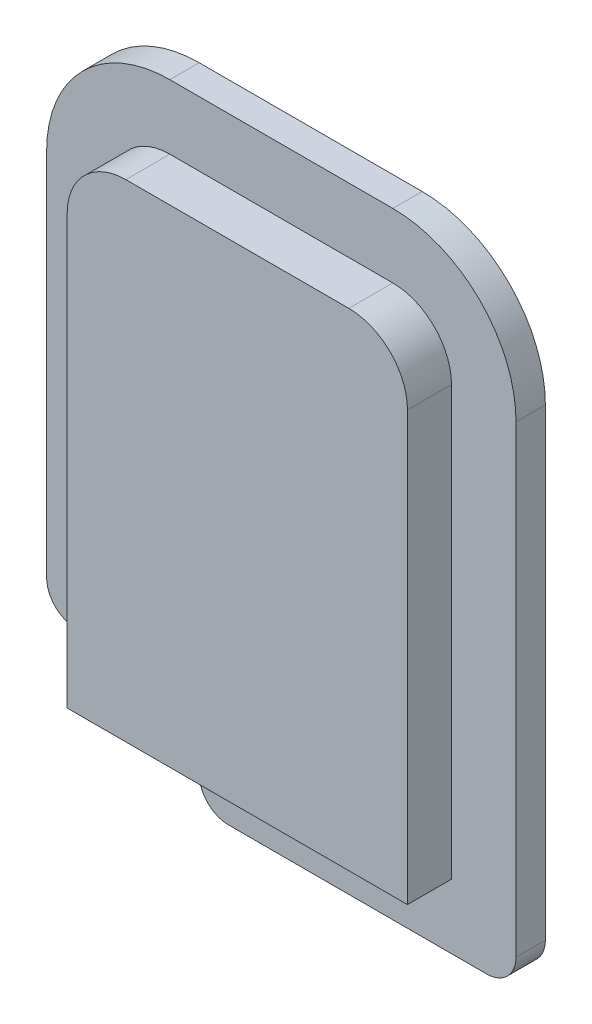
ISO-10303-21;
HEADER;
FILE_DESCRIPTION(('STEP AP214'),'2;1');
FILE_NAME('part.step','',(''),(''),'','','');
FILE_SCHEMA(('AUTOMOTIVE_DESIGN { 1 0 10303 214 1 1 1 1 }'));
ENDSEC;
DATA;
#1=APPLICATION_CONTEXT('core data for automotive mechanical design processes');
#2=APPLICATION_PROTOCOL_DEFINITION('international standard','automotive_design',2000,#1);
#3=PRODUCT_CONTEXT('',#1,'mechanical');
#4=PRODUCT('Part','Part','',(#3));
#5=PRODUCT_RELATED_PRODUCT_CATEGORY('part','',(#4));
#6=PRODUCT_DEFINITION_FORMATION('','',#4);
#7=PRODUCT_DEFINITION_CONTEXT('part definition',#1,'design');
#8=PRODUCT_DEFINITION('design','',#6,#7);
#9=PRODUCT_DEFINITION_SHAPE('','',#8);
#10=(LENGTH_UNIT() NAMED_UNIT(*) SI_UNIT(.MILLI.,.METRE.));
#11=(NAMED_UNIT(*) PLANE_ANGLE_UNIT() SI_UNIT($,.RADIAN.));
#12=(NAMED_UNIT(*) SI_UNIT($,.STERADIAN.) SOLID_ANGLE_UNIT());
#13=UNCERTAINTY_MEASURE_WITH_UNIT(LENGTH_MEASURE(1.E-05),#10,'distance_accuracy_value','');
#14=(GEOMETRIC_REPRESENTATION_CONTEXT(3) GLOBAL_UNCERTAINTY_ASSIGNED_CONTEXT((#13)) GLOBAL_UNIT_ASSIGNED_CONTEXT((#10,
#11,#12)) REPRESENTATION_CONTEXT('',''));
#15=CARTESIAN_POINT('',(0.,0.,0.));
#16=DIRECTION('',(0.,0.,1.));
#17=DIRECTION('',(1.,0.,0.));
#18=AXIS2_PLACEMENT_3D('',#15,#16,#17);
#19=CARTESIAN_POINT('',(-5.,-7.5,-1.2));
#20=DIRECTION('',(0.,1.,0.));
#21=DIRECTION('',(0.,0.,1.));
#22=AXIS2_PLACEMENT_3D('',#19,#20,#21);
#23=PLANE('',#22);
#24=DIRECTION('',(-1.,0.,0.));
#25=VECTOR('',#24,1.);
#26=CARTESIAN_POINT('',(-5.,-7.5,0.));
#27=LINE('',#26,#25);
#28=CARTESIAN_POINT('',(5.,-7.5,0.));
#29=VERTEX_POINT('',#28);
#30=CARTESIAN_POINT('',(-5.,-7.5,0.));
#31=VERTEX_POINT('',#30);
#32=EDGE_CURVE('E331',#29,#31,#27,.T.);
#33=ORIENTED_EDGE('',*,*,#32,.F.);
#34=DIRECTION('',(0.,0.,1.));
#35=VECTOR('',#34,1.);
#36=CARTESIAN_POINT('',(5.,-7.5,-1.2));
#37=LINE('',#36,#35);
#38=CARTESIAN_POINT('',(5.,-7.5,-2.2));
#39=VERTEX_POINT('',#38);
#40=EDGE_CURVE('E217',#39,#29,#37,.T.);
#41=ORIENTED_EDGE('',*,*,#40,.F.);
#42=DIRECTION('',(-1.,0.,0.));
#43=VECTOR('',#42,1.);
#44=CARTESIAN_POINT('',(5.,-7.5,-2.2));
#45=LINE('',#44,#43);
#46=CARTESIAN_POINT('',(-5.,-7.5,-2.2));
#47=VERTEX_POINT('',#46);
#48=EDGE_CURVE('E233',#39,#47,#45,.T.);
#49=ORIENTED_EDGE('',*,*,#48,.T.);
#50=DIRECTION('',(0.,0.,1.));
#51=VECTOR('',#50,1.);
#52=CARTESIAN_POINT('',(-5.,-7.5,-1.2));
#53=LINE('',#52,#51);
#54=EDGE_CURVE('E364',#47,#31,#53,.T.);
#55=ORIENTED_EDGE('',*,*,#54,.T.);
#56=EDGE_LOOP('',(#33,#41,#49,#55));
#57=FACE_BOUND('',#56,.T.);
#58=ADVANCED_FACE('F43',(#57),#23,.T.);
#59=CARTESIAN_POINT('',(-5.,6.3,-1.2));
#60=DIRECTION('',(1.,0.,0.));
#61=DIRECTION('',(0.,0.,-1.));
#62=AXIS2_PLACEMENT_3D('',#59,#60,#61);
#63=PLANE('',#62);
#64=DIRECTION('',(0.,1.,0.));
#65=VECTOR('',#64,1.);
#66=CARTESIAN_POINT('',(-5.,6.3,0.));
#67=LINE('',#66,#65);
#68=CARTESIAN_POINT('',(-5.,6.3,0.));
#69=VERTEX_POINT('',#68);
#70=EDGE_CURVE('E337',#31,#69,#67,.T.);
#71=ORIENTED_EDGE('',*,*,#70,.F.);
#72=ORIENTED_EDGE('',*,*,#54,.F.);
#73=DIRECTION('',(0.,1.,0.));
#74=VECTOR('',#73,1.);
#75=CARTESIAN_POINT('',(-5.,-7.5,-2.2));
#76=LINE('',#75,#74);
#77=CARTESIAN_POINT('',(-5.,6.3,-2.2));
#78=VERTEX_POINT('',#77);
#79=EDGE_CURVE('E240',#47,#78,#76,.T.);
#80=ORIENTED_EDGE('',*,*,#79,.T.);
#81=DIRECTION('',(0.,0.,1.));
#82=VECTOR('',#81,1.);
#83=CARTESIAN_POINT('',(-5.,6.3,-1.2));
#84=LINE('',#83,#82);
#85=EDGE_CURVE('E362',#78,#69,#84,.T.);
#86=ORIENTED_EDGE('',*,*,#85,.T.);
#87=EDGE_LOOP('',(#71,#72,#80,#86));
#88=FACE_BOUND('',#87,.T.);
#89=ADVANCED_FACE('F525',(#88),#63,.T.);
#90=CARTESIAN_POINT('',(-3.8,6.3,-1.2));
#91=DIRECTION('',(0.,0.,1.));
#92=DIRECTION('',(1.,0.,0.));
#93=AXIS2_PLACEMENT_3D('',#90,#91,#92);
#94=CYLINDRICAL_SURFACE('',#93,1.2);
#95=CARTESIAN_POINT('',(-3.8,6.3,0.));
#96=DIRECTION('',(0.,0.,-1.));
#97=DIRECTION('',(-1.,0.,0.));
#98=AXIS2_PLACEMENT_3D('',#95,#96,#97);
#99=CIRCLE('',#98,1.2);
#100=CARTESIAN_POINT('',(-3.8,7.5,0.));
#101=VERTEX_POINT('',#100);
#102=EDGE_CURVE('E345',#69,#101,#99,.T.);
#103=ORIENTED_EDGE('',*,*,#102,.F.);
#104=ORIENTED_EDGE('',*,*,#85,.F.);
#105=CARTESIAN_POINT('',(-3.8,6.3,-2.2));
#106=DIRECTION('',(0.,0.,-1.));
#107=DIRECTION('',(-1.,0.,0.));
#108=AXIS2_PLACEMENT_3D('',#105,#106,#107);
#109=CIRCLE('',#108,1.2);
#110=CARTESIAN_POINT('',(-3.8,7.5,-2.2));
#111=VERTEX_POINT('',#110);
#112=EDGE_CURVE('E242',#78,#111,#109,.T.);
#113=ORIENTED_EDGE('',*,*,#112,.T.);
#114=DIRECTION('',(0.,0.,1.));
#115=VECTOR('',#114,1.);
#116=CARTESIAN_POINT('',(-3.8,7.5,-1.2));
#117=LINE('',#116,#115);
#118=EDGE_CURVE('E359',#111,#101,#117,.T.);
#119=ORIENTED_EDGE('',*,*,#118,.T.);
#120=EDGE_LOOP('',(#103,#104,#113,#119));
#121=FACE_BOUND('',#120,.T.);
#122=ADVANCED_FACE('F527',(#121),#94,.F.);
#123=CARTESIAN_POINT('',(3.8,7.5,-1.2));
#124=DIRECTION('',(0.,-1.,0.));
#125=DIRECTION('',(0.,0.,-1.));
#126=AXIS2_PLACEMENT_3D('',#123,#124,#125);
#127=PLANE('',#126);
#128=DIRECTION('',(1.,0.,0.));
#129=VECTOR('',#128,1.);
#130=CARTESIAN_POINT('',(3.8,7.5,0.));
#131=LINE('',#130,#129);
#132=CARTESIAN_POINT('',(3.8,7.5,0.));
#133=VERTEX_POINT('',#132);
#134=EDGE_CURVE('E347',#101,#133,#131,.T.);
#135=ORIENTED_EDGE('',*,*,#134,.F.);
#136=ORIENTED_EDGE('',*,*,#118,.F.);
#137=DIRECTION('',(1.,0.,0.));
#138=VECTOR('',#137,1.);
#139=CARTESIAN_POINT('',(-3.8,7.5,-2.2));
#140=LINE('',#139,#138);
#141=CARTESIAN_POINT('',(3.8,7.5,-2.2));
#142=VERTEX_POINT('',#141);
#143=EDGE_CURVE('E250',#111,#142,#140,.T.);
#144=ORIENTED_EDGE('',*,*,#143,.T.);
#145=DIRECTION('',(0.,0.,1.));
#146=VECTOR('',#145,1.);
#147=CARTESIAN_POINT('',(3.8,7.5,-1.2));
#148=LINE('',#147,#146);
#149=EDGE_CURVE('E220',#142,#133,#148,.T.);
#150=ORIENTED_EDGE('',*,*,#149,.T.);
#151=EDGE_LOOP('',(#135,#136,#144,#150));
#152=FACE_BOUND('',#151,.T.);
#153=ADVANCED_FACE('F678',(#152),#127,.T.);
#154=CARTESIAN_POINT('',(3.8,6.3,-1.2));
#155=DIRECTION('',(0.,0.,1.));
#156=DIRECTION('',(1.,0.,0.));
#157=AXIS2_PLACEMENT_3D('',#154,#155,#156);
#158=CYLINDRICAL_SURFACE('',#157,1.2);
#159=CARTESIAN_POINT('',(3.8,6.3,0.));
#160=DIRECTION('',(0.,0.,-1.));
#161=DIRECTION('',(-1.,0.,0.));
#162=AXIS2_PLACEMENT_3D('',#159,#160,#161);
#163=CIRCLE('',#162,1.2);
#164=CARTESIAN_POINT('',(5.,6.3,0.));
#165=VERTEX_POINT('',#164);
#166=EDGE_CURVE('E348',#133,#165,#163,.T.);
#167=ORIENTED_EDGE('',*,*,#166,.F.);
#168=ORIENTED_EDGE('',*,*,#149,.F.);
#169=CARTESIAN_POINT('',(3.8,6.3,-2.2));
#170=DIRECTION('',(0.,0.,-1.));
#171=DIRECTION('',(-1.,0.,0.));
#172=AXIS2_PLACEMENT_3D('',#169,#170,#171);
#173=CIRCLE('',#172,1.2);
#174=CARTESIAN_POINT('',(5.,6.3,-2.2));
#175=VERTEX_POINT('',#174);
#176=EDGE_CURVE('E222',#142,#175,#173,.T.);
#177=ORIENTED_EDGE('',*,*,#176,.T.);
#178=DIRECTION('',(0.,0.,1.));
#179=VECTOR('',#178,1.);
#180=CARTESIAN_POINT('',(5.,6.3,-1.2));
#181=LINE('',#180,#179);
#182=EDGE_CURVE('E202',#175,#165,#181,.T.);
#183=ORIENTED_EDGE('',*,*,#182,.T.);
#184=EDGE_LOOP('',(#167,#168,#177,#183));
#185=FACE_BOUND('',#184,.T.);
#186=ADVANCED_FACE('F225',(#185),#158,.F.);
#187=CARTESIAN_POINT('',(5.,-7.5,-1.2));
#188=DIRECTION('',(-1.,0.,0.));
#189=DIRECTION('',(0.,0.,1.));
#190=AXIS2_PLACEMENT_3D('',#187,#188,#189);
#191=PLANE('',#190);
#192=DIRECTION('',(0.,-1.,0.));
#193=VECTOR('',#192,1.);
#194=CARTESIAN_POINT('',(5.,-7.5,0.));
#195=LINE('',#194,#193);
#196=EDGE_CURVE('E215',#165,#29,#195,.T.);
#197=ORIENTED_EDGE('',*,*,#196,.F.);
#198=ORIENTED_EDGE('',*,*,#182,.F.);
#199=DIRECTION('',(0.,-1.,0.));
#200=VECTOR('',#199,1.);
#201=CARTESIAN_POINT('',(5.,6.3,-2.2));
#202=LINE('',#201,#200);
#203=EDGE_CURVE('E207',#175,#39,#202,.T.);
#204=ORIENTED_EDGE('',*,*,#203,.T.);
#205=ORIENTED_EDGE('',*,*,#40,.T.);
#206=EDGE_LOOP('',(#197,#198,#204,#205));
#207=FACE_BOUND('',#206,.T.);
#208=ADVANCED_FACE('F210',(#207),#191,.T.);
#209=CARTESIAN_POINT('',(0.,0.,0.));
#210=DIRECTION('',(0.,0.,1.));
#211=DIRECTION('',(1.,0.,0.));
#212=AXIS2_PLACEMENT_3D('',#209,#210,#211);
#213=PLANE('',#212);
#214=ORIENTED_EDGE('',*,*,#196,.T.);
#215=ORIENTED_EDGE('',*,*,#32,.T.);
#216=ORIENTED_EDGE('',*,*,#70,.T.);
#217=ORIENTED_EDGE('',*,*,#102,.T.);
#218=ORIENTED_EDGE('',*,*,#134,.T.);
#219=ORIENTED_EDGE('',*,*,#166,.T.);
#220=EDGE_LOOP('',(#214,#215,#216,#217,#218,#219));
#221=FACE_BOUND('',#220,.T.);
#222=ADVANCED_FACE('F538',(#221),#213,.F.);
#223=CARTESIAN_POINT('',(3.8,6.3,-1.2));
#224=DIRECTION('',(0.,0.,-1.));
#225=DIRECTION('',(-1.,0.,0.));
#226=AXIS2_PLACEMENT_3D('',#223,#224,#225);
#227=PLANE('',#226);
#228=DIRECTION('',(0.,1.,0.));
#229=VECTOR('',#228,1.);
#230=CARTESIAN_POINT('',(-8.,-7.3,-1.2));
#231=LINE('',#230,#229);
#232=CARTESIAN_POINT('',(-8.,-6.3,-1.2));
#233=VERTEX_POINT('',#232);
#234=CARTESIAN_POINT('',(-8.,6.3,-1.2));
#235=VERTEX_POINT('',#234);
#236=EDGE_CURVE('E301',#233,#235,#231,.T.);
#237=ORIENTED_EDGE('',*,*,#236,.F.);
#238=CARTESIAN_POINT('',(-7.,-6.3,-1.2));
#239=DIRECTION('',(0.,0.,-1.));
#240=DIRECTION('',(-1.,0.,0.));
#241=AXIS2_PLACEMENT_3D('',#238,#239,#240);
#242=CIRCLE('',#241,1.);
#243=CARTESIAN_POINT('',(-7.,-7.3,-1.2));
#244=VERTEX_POINT('',#243);
#245=EDGE_CURVE('E445',#233,#244,#242,.F.);
#246=ORIENTED_EDGE('',*,*,#245,.T.);
#247=DIRECTION('',(-1.,0.,0.));
#248=VECTOR('',#247,1.);
#249=CARTESIAN_POINT('',(-5.8,-7.3,-1.2));
#250=LINE('',#249,#248);
#251=CARTESIAN_POINT('',(-5.8,-7.3,-1.2));
#252=VERTEX_POINT('',#251);
#253=EDGE_CURVE('E299',#252,#244,#250,.T.);
#254=ORIENTED_EDGE('',*,*,#253,.F.);
#255=DIRECTION('',(0.,1.,0.));
#256=VECTOR('',#255,1.);
#257=CARTESIAN_POINT('',(-5.8,6.3,-1.2));
#258=LINE('',#257,#256);
#259=CARTESIAN_POINT('',(-5.8,6.3,-1.2));
#260=VERTEX_POINT('',#259);
#261=EDGE_CURVE('E373',#252,#260,#258,.T.);
#262=ORIENTED_EDGE('',*,*,#261,.T.);
#263=CARTESIAN_POINT('',(-3.8,6.3,-1.2));
#264=DIRECTION('',(0.,0.,-1.));
#265=DIRECTION('',(-1.,0.,0.));
#266=AXIS2_PLACEMENT_3D('',#263,#264,#265);
#267=CIRCLE('',#266,2.);
#268=CARTESIAN_POINT('',(-3.8,8.3,-1.2));
#269=VERTEX_POINT('',#268);
#270=EDGE_CURVE('E380',#260,#269,#267,.T.);
#271=ORIENTED_EDGE('',*,*,#270,.T.);
#272=DIRECTION('',(1.,0.,0.));
#273=VECTOR('',#272,1.);
#274=CARTESIAN_POINT('',(3.8,8.3,-1.2));
#275=LINE('',#274,#273);
#276=CARTESIAN_POINT('',(3.8,8.3,-1.2));
#277=VERTEX_POINT('',#276);
#278=EDGE_CURVE('E381',#269,#277,#275,.T.);
#279=ORIENTED_EDGE('',*,*,#278,.T.);
#280=CARTESIAN_POINT('',(3.8,6.3,-1.2));
#281=DIRECTION('',(0.,0.,-1.));
#282=DIRECTION('',(-1.,0.,0.));
#283=AXIS2_PLACEMENT_3D('',#280,#281,#282);
#284=CIRCLE('',#283,2.);
#285=CARTESIAN_POINT('',(5.8,6.3,-1.2));
#286=VERTEX_POINT('',#285);
#287=EDGE_CURVE('E384',#277,#286,#284,.T.);
#288=ORIENTED_EDGE('',*,*,#287,.T.);
#289=DIRECTION('',(0.,-1.,0.));
#290=VECTOR('',#289,1.);
#291=CARTESIAN_POINT('',(5.8,-8.3,-1.2));
#292=LINE('',#291,#290);
#293=CARTESIAN_POINT('',(5.8,-8.3,-1.2));
#294=VERTEX_POINT('',#293);
#295=EDGE_CURVE('E386',#286,#294,#292,.T.);
#296=ORIENTED_EDGE('',*,*,#295,.T.);
#297=DIRECTION('',(-1.,0.,0.));
#298=VECTOR('',#297,1.);
#299=CARTESIAN_POINT('',(-5.8,-8.3,-1.2));
#300=LINE('',#299,#298);
#301=CARTESIAN_POINT('',(-2.8,-8.3,-1.2));
#302=VERTEX_POINT('',#301);
#303=EDGE_CURVE('E369',#294,#302,#300,.T.);
#304=ORIENTED_EDGE('',*,*,#303,.T.);
#305=DIRECTION('',(0.,1.,0.));
#306=VECTOR('',#305,1.);
#307=CARTESIAN_POINT('',(-2.8,-8.3,-1.2));
#308=LINE('',#307,#306);
#309=CARTESIAN_POINT('',(-2.8,-9.5,-1.2));
#310=VERTEX_POINT('',#309);
#311=EDGE_CURVE('E300',#310,#302,#308,.T.);
#312=ORIENTED_EDGE('',*,*,#311,.F.);
#313=CARTESIAN_POINT('',(-1.8,-9.5,-1.2));
#314=DIRECTION('',(0.,0.,-1.));
#315=DIRECTION('',(-1.,0.,0.));
#316=AXIS2_PLACEMENT_3D('',#313,#314,#315);
#317=CIRCLE('',#316,1.);
#318=CARTESIAN_POINT('',(-1.79999999999999,-10.5,-1.2));
#319=VERTEX_POINT('',#318);
#320=EDGE_CURVE('E438',#310,#319,#317,.F.);
#321=ORIENTED_EDGE('',*,*,#320,.T.);
#322=DIRECTION('',(-1.,0.,0.));
#323=VECTOR('',#322,1.);
#324=CARTESIAN_POINT('',(8.,-10.5,-1.2));
#325=LINE('',#324,#323);
#326=CARTESIAN_POINT('',(7.,-10.5,-1.2));
#327=VERTEX_POINT('',#326);
#328=EDGE_CURVE('E294',#327,#319,#325,.T.);
#329=ORIENTED_EDGE('',*,*,#328,.F.);
#330=CARTESIAN_POINT('',(7.,-9.5,-1.2));
#331=DIRECTION('',(0.,0.,-1.));
#332=DIRECTION('',(-1.,0.,0.));
#333=AXIS2_PLACEMENT_3D('',#330,#331,#332);
#334=CIRCLE('',#333,1.);
#335=CARTESIAN_POINT('',(8.,-9.5,-1.2));
#336=VERTEX_POINT('',#335);
#337=EDGE_CURVE('E436',#327,#336,#334,.F.);
#338=ORIENTED_EDGE('',*,*,#337,.T.);
#339=DIRECTION('',(0.,-1.,0.));
#340=VECTOR('',#339,1.);
#341=CARTESIAN_POINT('',(8.,6.3,-1.2));
#342=LINE('',#341,#340);
#343=CARTESIAN_POINT('',(8.,6.3,-1.2));
#344=VERTEX_POINT('',#343);
#345=EDGE_CURVE('E287',#344,#336,#342,.T.);
#346=ORIENTED_EDGE('',*,*,#345,.F.);
#347=CARTESIAN_POINT('',(3.8,6.3,-1.2));
#348=DIRECTION('',(0.,0.,-1.));
#349=DIRECTION('',(-1.,0.,0.));
#350=AXIS2_PLACEMENT_3D('',#347,#348,#349);
#351=CIRCLE('',#350,4.2);
#352=CARTESIAN_POINT('',(3.8,10.5,-1.2));
#353=VERTEX_POINT('',#352);
#354=EDGE_CURVE('E247',#353,#344,#351,.T.);
#355=ORIENTED_EDGE('',*,*,#354,.F.);
#356=DIRECTION('',(1.,0.,0.));
#357=VECTOR('',#356,1.);
#358=CARTESIAN_POINT('',(-3.8,10.5,-1.2));
#359=LINE('',#358,#357);
#360=CARTESIAN_POINT('',(-3.8,10.5,-1.2));
#361=VERTEX_POINT('',#360);
#362=EDGE_CURVE('E258',#361,#353,#359,.T.);
#363=ORIENTED_EDGE('',*,*,#362,.F.);
#364=CARTESIAN_POINT('',(-3.8,6.3,-1.2));
#365=DIRECTION('',(0.,0.,-1.));
#366=DIRECTION('',(-1.,0.,0.));
#367=AXIS2_PLACEMENT_3D('',#364,#365,#366);
#368=CIRCLE('',#367,4.2);
#369=EDGE_CURVE('E308',#235,#361,#368,.T.);
#370=ORIENTED_EDGE('',*,*,#369,.F.);
#371=EDGE_LOOP('',(#237,#246,#254,#262,#271,#279,#288,#296,#304,#312,#321,#329,#338,#346,#355,
#363,#370));
#372=FACE_BOUND('',#371,.T.);
#373=ADVANCED_FACE('F467',(#372),#227,.F.);
#374=CARTESIAN_POINT('',(3.8,6.3,-2.2));
#375=DIRECTION('',(0.,0.,-1.));
#376=DIRECTION('',(-1.,0.,0.));
#377=AXIS2_PLACEMENT_3D('',#374,#375,#376);
#378=PLANE('',#377);
#379=DIRECTION('',(-1.,0.,0.));
#380=VECTOR('',#379,1.);
#381=CARTESIAN_POINT('',(-5.8,-7.3,-2.2));
#382=LINE('',#381,#380);
#383=CARTESIAN_POINT('',(-5.8,-7.3,-2.2));
#384=VERTEX_POINT('',#383);
#385=CARTESIAN_POINT('',(-7.,-7.3,-2.2));
#386=VERTEX_POINT('',#385);
#387=EDGE_CURVE('E272',#384,#386,#382,.T.);
#388=ORIENTED_EDGE('',*,*,#387,.T.);
#389=CARTESIAN_POINT('',(-7.,-6.3,-2.2));
#390=DIRECTION('',(0.,0.,-1.));
#391=DIRECTION('',(-1.,0.,0.));
#392=AXIS2_PLACEMENT_3D('',#389,#390,#391);
#393=CIRCLE('',#392,1.);
#394=CARTESIAN_POINT('',(-8.,-6.3,-2.2));
#395=VERTEX_POINT('',#394);
#396=EDGE_CURVE('E451',#386,#395,#393,.T.);
#397=ORIENTED_EDGE('',*,*,#396,.T.);
#398=DIRECTION('',(0.,1.,0.));
#399=VECTOR('',#398,1.);
#400=CARTESIAN_POINT('',(-8.,-7.3,-2.2));
#401=LINE('',#400,#399);
#402=CARTESIAN_POINT('',(-8.,6.3,-2.2));
#403=VERTEX_POINT('',#402);
#404=EDGE_CURVE('E280',#395,#403,#401,.T.);
#405=ORIENTED_EDGE('',*,*,#404,.T.);
#406=CARTESIAN_POINT('',(-3.8,6.3,-2.2));
#407=DIRECTION('',(0.,0.,-1.));
#408=DIRECTION('',(-1.,0.,0.));
#409=AXIS2_PLACEMENT_3D('',#406,#407,#408);
#410=CIRCLE('',#409,4.2);
#411=CARTESIAN_POINT('',(-3.8,10.5,-2.2));
#412=VERTEX_POINT('',#411);
#413=EDGE_CURVE('E278',#403,#412,#410,.T.);
#414=ORIENTED_EDGE('',*,*,#413,.T.);
#415=DIRECTION('',(1.,0.,0.));
#416=VECTOR('',#415,1.);
#417=CARTESIAN_POINT('',(-3.8,10.5,-2.2));
#418=LINE('',#417,#416);
#419=CARTESIAN_POINT('',(3.8,10.5,-2.2));
#420=VERTEX_POINT('',#419);
#421=EDGE_CURVE('E282',#412,#420,#418,.T.);
#422=ORIENTED_EDGE('',*,*,#421,.T.);
#423=CARTESIAN_POINT('',(3.8,6.3,-2.2));
#424=DIRECTION('',(0.,0.,-1.));
#425=DIRECTION('',(-1.,0.,0.));
#426=AXIS2_PLACEMENT_3D('',#423,#424,#425);
#427=CIRCLE('',#426,4.2);
#428=CARTESIAN_POINT('',(8.,6.3,-2.2));
#429=VERTEX_POINT('',#428);
#430=EDGE_CURVE('E253',#420,#429,#427,.T.);
#431=ORIENTED_EDGE('',*,*,#430,.T.);
#432=DIRECTION('',(0.,-1.,0.));
#433=VECTOR('',#432,1.);
#434=CARTESIAN_POINT('',(8.,6.3,-2.2));
#435=LINE('',#434,#433);
#436=CARTESIAN_POINT('',(8.,-9.5,-2.2));
#437=VERTEX_POINT('',#436);
#438=EDGE_CURVE('E254',#429,#437,#435,.T.);
#439=ORIENTED_EDGE('',*,*,#438,.T.);
#440=CARTESIAN_POINT('',(7.,-9.5,-2.2));
#441=DIRECTION('',(0.,0.,-1.));
#442=DIRECTION('',(-1.,0.,0.));
#443=AXIS2_PLACEMENT_3D('',#440,#441,#442);
#444=CIRCLE('',#443,1.);
#445=CARTESIAN_POINT('',(7.,-10.5,-2.2));
#446=VERTEX_POINT('',#445);
#447=EDGE_CURVE('E447',#437,#446,#444,.T.);
#448=ORIENTED_EDGE('',*,*,#447,.T.);
#449=DIRECTION('',(-1.,0.,0.));
#450=VECTOR('',#449,1.);
#451=CARTESIAN_POINT('',(8.,-10.5,-2.2));
#452=LINE('',#451,#450);
#453=CARTESIAN_POINT('',(-1.79999999999999,-10.5,-2.2));
#454=VERTEX_POINT('',#453);
#455=EDGE_CURVE('E257',#446,#454,#452,.T.);
#456=ORIENTED_EDGE('',*,*,#455,.T.);
#457=CARTESIAN_POINT('',(-1.8,-9.5,-2.2));
#458=DIRECTION('',(0.,0.,-1.));
#459=DIRECTION('',(-1.,0.,0.));
#460=AXIS2_PLACEMENT_3D('',#457,#458,#459);
#461=CIRCLE('',#460,1.);
#462=CARTESIAN_POINT('',(-2.8,-9.5,-2.2));
#463=VERTEX_POINT('',#462);
#464=EDGE_CURVE('E56',#454,#463,#461,.T.);
#465=ORIENTED_EDGE('',*,*,#464,.T.);
#466=DIRECTION('',(0.,1.,0.));
#467=VECTOR('',#466,1.);
#468=CARTESIAN_POINT('',(-2.8,-8.3,-2.2));
#469=LINE('',#468,#467);
#470=CARTESIAN_POINT('',(-2.8,-8.3,-2.2));
#471=VERTEX_POINT('',#470);
#472=EDGE_CURVE('E263',#463,#471,#469,.T.);
#473=ORIENTED_EDGE('',*,*,#472,.T.);
#474=DIRECTION('',(-1.,0.,0.));
#475=VECTOR('',#474,1.);
#476=CARTESIAN_POINT('',(-2.8,-8.3,-2.2));
#477=LINE('',#476,#475);
#478=CARTESIAN_POINT('',(-5.8,-8.3,-2.2));
#479=VERTEX_POINT('',#478);
#480=EDGE_CURVE('E266',#471,#479,#477,.T.);
#481=ORIENTED_EDGE('',*,*,#480,.T.);
#482=DIRECTION('',(0.,1.,0.));
#483=VECTOR('',#482,1.);
#484=CARTESIAN_POINT('',(-5.8,-8.3,-2.2));
#485=LINE('',#484,#483);
#486=EDGE_CURVE('E269',#479,#384,#485,.T.);
#487=ORIENTED_EDGE('',*,*,#486,.T.);
#488=EDGE_LOOP('',(#388,#397,#405,#414,#422,#431,#439,#448,#456,#465,#473,#481,#487));
#489=FACE_BOUND('',#488,.T.);
#490=ORIENTED_EDGE('',*,*,#203,.F.);
#491=ORIENTED_EDGE('',*,*,#176,.F.);
#492=ORIENTED_EDGE('',*,*,#143,.F.);
#493=ORIENTED_EDGE('',*,*,#112,.F.);
#494=ORIENTED_EDGE('',*,*,#79,.F.);
#495=ORIENTED_EDGE('',*,*,#48,.F.);
#496=EDGE_LOOP('',(#490,#491,#492,#493,#494,#495));
#497=FACE_BOUND('',#496,.T.);
#498=ADVANCED_FACE('F227',(#489,#497),#378,.T.);
#499=CARTESIAN_POINT('',(3.8,6.3,-2.2));
#500=DIRECTION('',(0.,0.,1.));
#501=DIRECTION('',(1.,0.,0.));
#502=AXIS2_PLACEMENT_3D('',#499,#500,#501);
#503=CYLINDRICAL_SURFACE('',#502,4.2);
#504=ORIENTED_EDGE('',*,*,#354,.T.);
#505=DIRECTION('',(0.,0.,1.));
#506=VECTOR('',#505,1.);
#507=CARTESIAN_POINT('',(8.,6.3,-2.2));
#508=LINE('',#507,#506);
#509=EDGE_CURVE('E329',#429,#344,#508,.T.);
#510=ORIENTED_EDGE('',*,*,#509,.F.);
#511=ORIENTED_EDGE('',*,*,#430,.F.);
#512=DIRECTION('',(0.,0.,1.));
#513=VECTOR('',#512,1.);
#514=CARTESIAN_POINT('',(3.8,10.5,-2.2));
#515=LINE('',#514,#513);
#516=EDGE_CURVE('E288',#420,#353,#515,.T.);
#517=ORIENTED_EDGE('',*,*,#516,.T.);
#518=EDGE_LOOP('',(#504,#510,#511,#517));
#519=FACE_BOUND('',#518,.T.);
#520=ADVANCED_FACE('F514',(#519),#503,.T.);
#521=CARTESIAN_POINT('',(8.,6.3,-2.2));
#522=DIRECTION('',(-1.,0.,0.));
#523=DIRECTION('',(0.,0.,1.));
#524=AXIS2_PLACEMENT_3D('',#521,#522,#523);
#525=PLANE('',#524);
#526=ORIENTED_EDGE('',*,*,#345,.T.);
#527=DIRECTION('',(0.,0.,1.));
#528=VECTOR('',#527,1.);
#529=CARTESIAN_POINT('',(8.,-9.5,-2.2));
#530=LINE('',#529,#528);
#531=EDGE_CURVE('E11',#336,#437,#530,.F.);
#532=ORIENTED_EDGE('',*,*,#531,.T.);
#533=ORIENTED_EDGE('',*,*,#438,.F.);
#534=ORIENTED_EDGE('',*,*,#509,.T.);
#535=EDGE_LOOP('',(#526,#532,#533,#534));
#536=FACE_BOUND('',#535,.T.);
#537=ADVANCED_FACE('F516',(#536),#525,.F.);
#538=CARTESIAN_POINT('',(8.,-10.5,-2.2));
#539=DIRECTION('',(0.,1.,0.));
#540=DIRECTION('',(-1.,0.,0.));
#541=AXIS2_PLACEMENT_3D('',#538,#539,#540);
#542=PLANE('',#541);
#543=ORIENTED_EDGE('',*,*,#328,.T.);
#544=DIRECTION('',(0.,0.,1.));
#545=VECTOR('',#544,1.);
#546=CARTESIAN_POINT('',(-1.8,-10.5,-2.2));
#547=LINE('',#546,#545);
#548=EDGE_CURVE('E55',#319,#454,#547,.F.);
#549=ORIENTED_EDGE('',*,*,#548,.T.);
#550=ORIENTED_EDGE('',*,*,#455,.F.);
#551=DIRECTION('',(0.,0.,1.));
#552=VECTOR('',#551,1.);
#553=CARTESIAN_POINT('',(7.,-10.5,-2.2));
#554=LINE('',#553,#552);
#555=EDGE_CURVE('E459',#446,#327,#554,.T.);
#556=ORIENTED_EDGE('',*,*,#555,.T.);
#557=EDGE_LOOP('',(#543,#549,#550,#556));
#558=FACE_BOUND('',#557,.T.);
#559=ADVANCED_FACE('F464',(#558),#542,.F.);
#560=CARTESIAN_POINT('',(-2.8,-8.3,-2.2));
#561=DIRECTION('',(1.,0.,0.));
#562=DIRECTION('',(0.,1.,0.));
#563=AXIS2_PLACEMENT_3D('',#560,#561,#562);
#564=PLANE('',#563);
#565=ORIENTED_EDGE('',*,*,#472,.F.);
#566=DIRECTION('',(0.,0.,1.));
#567=VECTOR('',#566,1.);
#568=CARTESIAN_POINT('',(-2.8,-9.5,-2.2));
#569=LINE('',#568,#567);
#570=EDGE_CURVE('E457',#463,#310,#569,.T.);
#571=ORIENTED_EDGE('',*,*,#570,.T.);
#572=ORIENTED_EDGE('',*,*,#311,.T.);
#573=DIRECTION('',(0.,0.,1.));
#574=VECTOR('',#573,1.);
#575=CARTESIAN_POINT('',(-2.8,-8.3,-2.2));
#576=LINE('',#575,#574);
#577=EDGE_CURVE('E326',#471,#302,#576,.T.);
#578=ORIENTED_EDGE('',*,*,#577,.F.);
#579=EDGE_LOOP('',(#565,#571,#572,#578));
#580=FACE_BOUND('',#579,.T.);
#581=ADVANCED_FACE('F478',(#580),#564,.F.);
#582=CARTESIAN_POINT('',(-5.8,-7.3,-2.2));
#583=DIRECTION('',(0.,1.,0.));
#584=DIRECTION('',(0.,0.,1.));
#585=AXIS2_PLACEMENT_3D('',#582,#583,#584);
#586=PLANE('',#585);
#587=ORIENTED_EDGE('',*,*,#253,.T.);
#588=DIRECTION('',(0.,0.,1.));
#589=VECTOR('',#588,1.);
#590=CARTESIAN_POINT('',(-7.,-7.3,-2.2));
#591=LINE('',#590,#589);
#592=EDGE_CURVE('E443',#244,#386,#591,.F.);
#593=ORIENTED_EDGE('',*,*,#592,.T.);
#594=ORIENTED_EDGE('',*,*,#387,.F.);
#595=DIRECTION('',(0.,0.,1.));
#596=VECTOR('',#595,1.);
#597=CARTESIAN_POINT('',(-5.8,-7.3,-2.2));
#598=LINE('',#597,#596);
#599=EDGE_CURVE('E325',#384,#252,#598,.T.);
#600=ORIENTED_EDGE('',*,*,#599,.T.);
#601=EDGE_LOOP('',(#587,#593,#594,#600));
#602=FACE_BOUND('',#601,.T.);
#603=ADVANCED_FACE('F489',(#602),#586,.F.);
#604=CARTESIAN_POINT('',(-8.,-7.3,-2.2));
#605=DIRECTION('',(1.,0.,0.));
#606=DIRECTION('',(0.,0.,-1.));
#607=AXIS2_PLACEMENT_3D('',#604,#605,#606);
#608=PLANE('',#607);
#609=ORIENTED_EDGE('',*,*,#404,.F.);
#610=DIRECTION('',(0.,0.,1.));
#611=VECTOR('',#610,1.);
#612=CARTESIAN_POINT('',(-8.,-6.3,-2.2));
#613=LINE('',#612,#611);
#614=EDGE_CURVE('E435',#395,#233,#613,.T.);
#615=ORIENTED_EDGE('',*,*,#614,.T.);
#616=ORIENTED_EDGE('',*,*,#236,.T.);
#617=DIRECTION('',(0.,0.,1.));
#618=VECTOR('',#617,1.);
#619=CARTESIAN_POINT('',(-8.,6.3,-2.2));
#620=LINE('',#619,#618);
#621=EDGE_CURVE('E318',#403,#235,#620,.T.);
#622=ORIENTED_EDGE('',*,*,#621,.F.);
#623=EDGE_LOOP('',(#609,#615,#616,#622));
#624=FACE_BOUND('',#623,.T.);
#625=ADVANCED_FACE('F499',(#624),#608,.F.);
#626=CARTESIAN_POINT('',(-3.8,6.3,-2.2));
#627=DIRECTION('',(0.,0.,1.));
#628=DIRECTION('',(1.,0.,0.));
#629=AXIS2_PLACEMENT_3D('',#626,#627,#628);
#630=CYLINDRICAL_SURFACE('',#629,4.2);
#631=ORIENTED_EDGE('',*,*,#369,.T.);
#632=DIRECTION('',(0.,0.,1.));
#633=VECTOR('',#632,1.);
#634=CARTESIAN_POINT('',(-3.8,10.5,-2.2));
#635=LINE('',#634,#633);
#636=EDGE_CURVE('E314',#412,#361,#635,.T.);
#637=ORIENTED_EDGE('',*,*,#636,.F.);
#638=ORIENTED_EDGE('',*,*,#413,.F.);
#639=ORIENTED_EDGE('',*,*,#621,.T.);
#640=EDGE_LOOP('',(#631,#637,#638,#639));
#641=FACE_BOUND('',#640,.T.);
#642=ADVANCED_FACE('F504',(#641),#630,.T.);
#643=CARTESIAN_POINT('',(-3.8,10.5,-2.2));
#644=DIRECTION('',(0.,-1.,0.));
#645=DIRECTION('',(0.,0.,-1.));
#646=AXIS2_PLACEMENT_3D('',#643,#644,#645);
#647=PLANE('',#646);
#648=ORIENTED_EDGE('',*,*,#362,.T.);
#649=ORIENTED_EDGE('',*,*,#516,.F.);
#650=ORIENTED_EDGE('',*,*,#421,.F.);
#651=ORIENTED_EDGE('',*,*,#636,.T.);
#652=EDGE_LOOP('',(#648,#649,#650,#651));
#653=FACE_BOUND('',#652,.T.);
#654=ADVANCED_FACE('F509',(#653),#647,.F.);
#655=CARTESIAN_POINT('',(0.,0.,0.3));
#656=DIRECTION('',(0.,0.,1.));
#657=DIRECTION('',(1.,0.,0.));
#658=AXIS2_PLACEMENT_3D('',#655,#656,#657);
#659=PLANE('',#658);
#660=DIRECTION('',(-1.,0.,0.));
#661=VECTOR('',#660,1.);
#662=CARTESIAN_POINT('',(-5.8,8.3,0.3));
#663=LINE('',#662,#661);
#664=CARTESIAN_POINT('',(3.8,8.3,0.3));
#665=VERTEX_POINT('',#664);
#666=CARTESIAN_POINT('',(-3.8,8.3,0.3));
#667=VERTEX_POINT('',#666);
#668=EDGE_CURVE('E400',#665,#667,#663,.T.);
#669=ORIENTED_EDGE('',*,*,#668,.T.);
#670=CARTESIAN_POINT('',(-3.8,6.3,0.3));
#671=DIRECTION('',(0.,0.,1.));
#672=DIRECTION('',(1.,0.,0.));
#673=AXIS2_PLACEMENT_3D('',#670,#671,#672);
#674=CIRCLE('',#673,2.);
#675=CARTESIAN_POINT('',(-5.8,6.3,0.3));
#676=VERTEX_POINT('',#675);
#677=EDGE_CURVE('E426',#667,#676,#674,.T.);
#678=ORIENTED_EDGE('',*,*,#677,.T.);
#679=DIRECTION('',(0.,-1.,0.));
#680=VECTOR('',#679,1.);
#681=CARTESIAN_POINT('',(-5.8,8.3,0.3));
#682=LINE('',#681,#680);
#683=CARTESIAN_POINT('',(-5.8,-8.3,0.3));
#684=VERTEX_POINT('',#683);
#685=EDGE_CURVE('E402',#676,#684,#682,.T.);
#686=ORIENTED_EDGE('',*,*,#685,.T.);
#687=DIRECTION('',(1.,0.,0.));
#688=VECTOR('',#687,1.);
#689=CARTESIAN_POINT('',(-5.8,-8.3,0.3));
#690=LINE('',#689,#688);
#691=CARTESIAN_POINT('',(5.8,-8.3,0.3));
#692=VERTEX_POINT('',#691);
#693=EDGE_CURVE('E404',#684,#692,#690,.T.);
#694=ORIENTED_EDGE('',*,*,#693,.T.);
#695=DIRECTION('',(0.,1.,0.));
#696=VECTOR('',#695,1.);
#697=CARTESIAN_POINT('',(5.8,8.3,0.3));
#698=LINE('',#697,#696);
#699=CARTESIAN_POINT('',(5.8,6.3,0.3));
#700=VERTEX_POINT('',#699);
#701=EDGE_CURVE('E392',#692,#700,#698,.T.);
#702=ORIENTED_EDGE('',*,*,#701,.T.);
#703=CARTESIAN_POINT('',(3.8,6.3,0.3));
#704=DIRECTION('',(0.,0.,1.));
#705=DIRECTION('',(1.,0.,0.));
#706=AXIS2_PLACEMENT_3D('',#703,#704,#705);
#707=CIRCLE('',#706,2.);
#708=EDGE_CURVE('E421',#700,#665,#707,.T.);
#709=ORIENTED_EDGE('',*,*,#708,.T.);
#710=EDGE_LOOP('',(#669,#678,#686,#694,#702,#709));
#711=FACE_BOUND('',#710,.T.);
#712=ADVANCED_FACE('F531',(#711),#659,.T.);
#713=CARTESIAN_POINT('',(5.8,8.3,0.3));
#714=DIRECTION('',(-1.,0.,0.));
#715=DIRECTION('',(0.,-1.,0.));
#716=AXIS2_PLACEMENT_3D('',#713,#714,#715);
#717=PLANE('',#716);
#718=DIRECTION('',(0.,0.,-1.));
#719=VECTOR('',#718,1.);
#720=CARTESIAN_POINT('',(5.8,-8.3,0.3));
#721=LINE('',#720,#719);
#722=EDGE_CURVE('E410',#692,#294,#721,.T.);
#723=ORIENTED_EDGE('',*,*,#722,.T.);
#724=ORIENTED_EDGE('',*,*,#295,.F.);
#725=DIRECTION('',(0.,0.,-1.));
#726=VECTOR('',#725,1.);
#727=CARTESIAN_POINT('',(5.8,6.3,0.3));
#728=LINE('',#727,#726);
#729=EDGE_CURVE('E427',#286,#700,#728,.F.);
#730=ORIENTED_EDGE('',*,*,#729,.T.);
#731=ORIENTED_EDGE('',*,*,#701,.F.);
#732=EDGE_LOOP('',(#723,#724,#730,#731));
#733=FACE_BOUND('',#732,.T.);
#734=ADVANCED_FACE('F536',(#733),#717,.F.);
#735=CARTESIAN_POINT('',(3.8,6.3,0.3));
#736=DIRECTION('',(0.,0.,-1.));
#737=DIRECTION('',(-1.,0.,0.));
#738=AXIS2_PLACEMENT_3D('',#735,#736,#737);
#739=CYLINDRICAL_SURFACE('',#738,2.);
#740=ORIENTED_EDGE('',*,*,#708,.F.);
#741=ORIENTED_EDGE('',*,*,#729,.F.);
#742=ORIENTED_EDGE('',*,*,#287,.F.);
#743=DIRECTION('',(0.,0.,-1.));
#744=VECTOR('',#743,1.);
#745=CARTESIAN_POINT('',(3.8,8.3,0.3));
#746=LINE('',#745,#744);
#747=EDGE_CURVE('E417',#665,#277,#746,.T.);
#748=ORIENTED_EDGE('',*,*,#747,.F.);
#749=EDGE_LOOP('',(#740,#741,#742,#748));
#750=FACE_BOUND('',#749,.T.);
#751=ADVANCED_FACE('F552',(#750),#739,.T.);
#752=CARTESIAN_POINT('',(-5.8,8.3,0.3));
#753=DIRECTION('',(0.,-1.,0.));
#754=DIRECTION('',(0.,0.,-1.));
#755=AXIS2_PLACEMENT_3D('',#752,#753,#754);
#756=PLANE('',#755);
#757=ORIENTED_EDGE('',*,*,#747,.T.);
#758=ORIENTED_EDGE('',*,*,#278,.F.);
#759=DIRECTION('',(0.,0.,-1.));
#760=VECTOR('',#759,1.);
#761=CARTESIAN_POINT('',(-3.8,8.3,0.3));
#762=LINE('',#761,#760);
#763=EDGE_CURVE('E419',#269,#667,#762,.F.);
#764=ORIENTED_EDGE('',*,*,#763,.T.);
#765=ORIENTED_EDGE('',*,*,#668,.F.);
#766=EDGE_LOOP('',(#757,#758,#764,#765));
#767=FACE_BOUND('',#766,.T.);
#768=ADVANCED_FACE('F547',(#767),#756,.F.);
#769=CARTESIAN_POINT('',(-3.8,6.3,0.3));
#770=DIRECTION('',(0.,0.,-1.));
#771=DIRECTION('',(-1.,0.,0.));
#772=AXIS2_PLACEMENT_3D('',#769,#770,#771);
#773=CYLINDRICAL_SURFACE('',#772,2.);
#774=ORIENTED_EDGE('',*,*,#677,.F.);
#775=ORIENTED_EDGE('',*,*,#763,.F.);
#776=ORIENTED_EDGE('',*,*,#270,.F.);
#777=DIRECTION('',(0.,0.,-1.));
#778=VECTOR('',#777,1.);
#779=CARTESIAN_POINT('',(-5.8,6.3,0.3));
#780=LINE('',#779,#778);
#781=EDGE_CURVE('E414',#676,#260,#780,.T.);
#782=ORIENTED_EDGE('',*,*,#781,.F.);
#783=EDGE_LOOP('',(#774,#775,#776,#782));
#784=FACE_BOUND('',#783,.T.);
#785=ADVANCED_FACE('F550',(#784),#773,.T.);
#786=CARTESIAN_POINT('',(-5.8,8.3,0.3));
#787=DIRECTION('',(1.,0.,0.));
#788=DIRECTION('',(0.,1.,0.));
#789=AXIS2_PLACEMENT_3D('',#786,#787,#788);
#790=PLANE('',#789);
#791=ORIENTED_EDGE('',*,*,#685,.F.);
#792=ORIENTED_EDGE('',*,*,#781,.T.);
#793=ORIENTED_EDGE('',*,*,#261,.F.);
#794=ORIENTED_EDGE('',*,*,#599,.F.);
#795=ORIENTED_EDGE('',*,*,#486,.F.);
#796=DIRECTION('',(0.,0.,-1.));
#797=VECTOR('',#796,1.);
#798=CARTESIAN_POINT('',(-5.8,-8.3,0.3));
#799=LINE('',#798,#797);
#800=EDGE_CURVE('E413',#684,#479,#799,.T.);
#801=ORIENTED_EDGE('',*,*,#800,.F.);
#802=EDGE_LOOP('',(#791,#792,#793,#794,#795,#801));
#803=FACE_BOUND('',#802,.T.);
#804=ADVANCED_FACE('F484',(#803),#790,.F.);
#805=CARTESIAN_POINT('',(-5.8,-8.3,0.3));
#806=DIRECTION('',(0.,1.,0.));
#807=DIRECTION('',(0.,0.,1.));
#808=AXIS2_PLACEMENT_3D('',#805,#806,#807);
#809=PLANE('',#808);
#810=ORIENTED_EDGE('',*,*,#800,.T.);
#811=ORIENTED_EDGE('',*,*,#480,.F.);
#812=ORIENTED_EDGE('',*,*,#577,.T.);
#813=ORIENTED_EDGE('',*,*,#303,.F.);
#814=ORIENTED_EDGE('',*,*,#722,.F.);
#815=ORIENTED_EDGE('',*,*,#693,.F.);
#816=EDGE_LOOP('',(#810,#811,#812,#813,#814,#815));
#817=FACE_BOUND('',#816,.T.);
#818=ADVANCED_FACE('F545',(#817),#809,.F.);
#819=CARTESIAN_POINT('',(-7.,-6.3,-2.2));
#820=DIRECTION('',(0.,0.,1.));
#821=DIRECTION('',(1.,0.,0.));
#822=AXIS2_PLACEMENT_3D('',#819,#820,#821);
#823=CYLINDRICAL_SURFACE('',#822,1.);
#824=ORIENTED_EDGE('',*,*,#396,.F.);
#825=ORIENTED_EDGE('',*,*,#592,.F.);
#826=ORIENTED_EDGE('',*,*,#245,.F.);
#827=ORIENTED_EDGE('',*,*,#614,.F.);
#828=EDGE_LOOP('',(#824,#825,#826,#827));
#829=FACE_BOUND('',#828,.T.);
#830=ADVANCED_FACE('F497',(#829),#823,.T.);
#831=CARTESIAN_POINT('',(-1.8,-9.5,-2.2));
#832=DIRECTION('',(0.,0.,1.));
#833=DIRECTION('',(1.,0.,0.));
#834=AXIS2_PLACEMENT_3D('',#831,#832,#833);
#835=CYLINDRICAL_SURFACE('',#834,1.);
#836=ORIENTED_EDGE('',*,*,#464,.F.);
#837=ORIENTED_EDGE('',*,*,#548,.F.);
#838=ORIENTED_EDGE('',*,*,#320,.F.);
#839=ORIENTED_EDGE('',*,*,#570,.F.);
#840=EDGE_LOOP('',(#836,#837,#838,#839));
#841=FACE_BOUND('',#840,.T.);
#842=ADVANCED_FACE('F475',(#841),#835,.T.);
#843=CARTESIAN_POINT('',(7.,-9.5,-2.2));
#844=DIRECTION('',(0.,0.,1.));
#845=DIRECTION('',(1.,0.,0.));
#846=AXIS2_PLACEMENT_3D('',#843,#844,#845);
#847=CYLINDRICAL_SURFACE('',#846,1.);
#848=ORIENTED_EDGE('',*,*,#447,.F.);
#849=ORIENTED_EDGE('',*,*,#531,.F.);
#850=ORIENTED_EDGE('',*,*,#337,.F.);
#851=ORIENTED_EDGE('',*,*,#555,.F.);
#852=EDGE_LOOP('',(#848,#849,#850,#851));
#853=FACE_BOUND('',#852,.T.);
#854=ADVANCED_FACE('F44',(#853),#847,.T.);
#855=CLOSED_SHELL('',(#58,#89,#122,#153,#186,#208,#222,#373,#498,#520,#537,#559,#581,#603,#625,
#642,#654,#712,#734,#751,#768,#785,#804,#818,#830,#842,#854));
#856=MANIFOLD_SOLID_BREP('B2',#855);
#857=ADVANCED_BREP_SHAPE_REPRESENTATION('',(#18,#856),#14);
#858=SHAPE_DEFINITION_REPRESENTATION(#9,#857);
ENDSEC;
END-ISO-10303-21;
